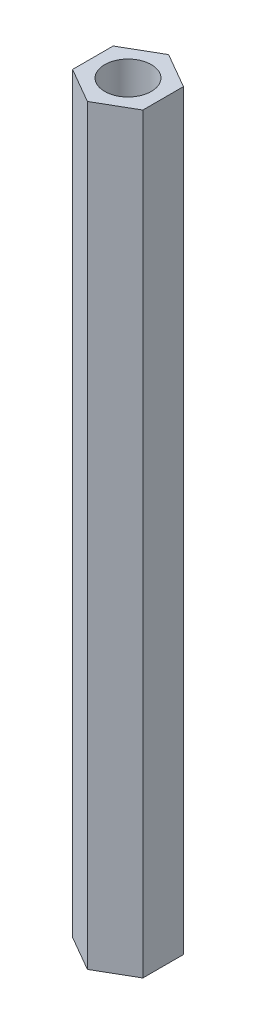
ISO-10303-21;
HEADER;
FILE_DESCRIPTION(('STEP AP214'),'2;1');
FILE_NAME('part.step','',(''),(''),'','','');
FILE_SCHEMA(('AUTOMOTIVE_DESIGN { 1 0 10303 214 1 1 1 1 }'));
ENDSEC;
DATA;
#1=APPLICATION_CONTEXT('core data for automotive mechanical design processes');
#2=APPLICATION_PROTOCOL_DEFINITION('international standard','automotive_design',2000,#1);
#3=PRODUCT_CONTEXT('',#1,'mechanical');
#4=PRODUCT('Part','Part','',(#3));
#5=PRODUCT_RELATED_PRODUCT_CATEGORY('part','',(#4));
#6=PRODUCT_DEFINITION_FORMATION('','',#4);
#7=PRODUCT_DEFINITION_CONTEXT('part definition',#1,'design');
#8=PRODUCT_DEFINITION('design','',#6,#7);
#9=PRODUCT_DEFINITION_SHAPE('','',#8);
#10=(LENGTH_UNIT() NAMED_UNIT(*) SI_UNIT(.MILLI.,.METRE.));
#11=(NAMED_UNIT(*) PLANE_ANGLE_UNIT() SI_UNIT($,.RADIAN.));
#12=(NAMED_UNIT(*) SI_UNIT($,.STERADIAN.) SOLID_ANGLE_UNIT());
#13=UNCERTAINTY_MEASURE_WITH_UNIT(LENGTH_MEASURE(1.E-05),#10,'distance_accuracy_value','');
#14=(GEOMETRIC_REPRESENTATION_CONTEXT(3) GLOBAL_UNCERTAINTY_ASSIGNED_CONTEXT((#13)) GLOBAL_UNIT_ASSIGNED_CONTEXT((#10,
#11,#12)) REPRESENTATION_CONTEXT('',''));
#15=CARTESIAN_POINT('',(0.,0.,0.));
#16=DIRECTION('',(0.,0.,1.));
#17=DIRECTION('',(1.,0.,0.));
#18=AXIS2_PLACEMENT_3D('',#15,#16,#17);
#19=CARTESIAN_POINT('',(0.,50.,0.));
#20=DIRECTION('',(0.,1.,0.));
#21=DIRECTION('',(0.,0.,1.));
#22=AXIS2_PLACEMENT_3D('',#19,#20,#21);
#23=PLANE('',#22);
#24=DIRECTION('',(-0.866025403784439,0.,-0.5));
#25=VECTOR('',#24,1.);
#26=CARTESIAN_POINT('',(2.33826859021798,50.,-1.35));
#27=LINE('',#26,#25);
#28=CARTESIAN_POINT('',(2.33826859021798,50.,-1.35));
#29=VERTEX_POINT('',#28);
#30=CARTESIAN_POINT('',(0.,50.,-2.7));
#31=VERTEX_POINT('',#30);
#32=EDGE_CURVE('E130',#29,#31,#27,.T.);
#33=ORIENTED_EDGE('',*,*,#32,.T.);
#34=DIRECTION('',(-0.866025403784439,0.,0.5));
#35=VECTOR('',#34,1.);
#36=CARTESIAN_POINT('',(0.,50.,-2.7));
#37=LINE('',#36,#35);
#38=CARTESIAN_POINT('',(-2.33826859021798,50.,-1.35));
#39=VERTEX_POINT('',#38);
#40=EDGE_CURVE('E88',#31,#39,#37,.T.);
#41=ORIENTED_EDGE('',*,*,#40,.T.);
#42=DIRECTION('',(0.,0.,1.));
#43=VECTOR('',#42,1.);
#44=CARTESIAN_POINT('',(-2.33826859021798,50.,-1.35));
#45=LINE('',#44,#43);
#46=CARTESIAN_POINT('',(-2.33826859021798,50.,1.35));
#47=VERTEX_POINT('',#46);
#48=EDGE_CURVE('E101',#39,#47,#45,.T.);
#49=ORIENTED_EDGE('',*,*,#48,.T.);
#50=DIRECTION('',(0.866025403784439,0.,0.5));
#51=VECTOR('',#50,1.);
#52=CARTESIAN_POINT('',(-2.33826859021798,50.,1.35));
#53=LINE('',#52,#51);
#54=CARTESIAN_POINT('',(0.,50.,2.7));
#55=VERTEX_POINT('',#54);
#56=EDGE_CURVE('E95',#47,#55,#53,.T.);
#57=ORIENTED_EDGE('',*,*,#56,.T.);
#58=DIRECTION('',(0.866025403784439,0.,-0.5));
#59=VECTOR('',#58,1.);
#60=CARTESIAN_POINT('',(0.,50.,2.7));
#61=LINE('',#60,#59);
#62=CARTESIAN_POINT('',(2.33826859021798,50.,1.35));
#63=VERTEX_POINT('',#62);
#64=EDGE_CURVE('E99',#55,#63,#61,.T.);
#65=ORIENTED_EDGE('',*,*,#64,.T.);
#66=DIRECTION('',(0.,0.,-1.));
#67=VECTOR('',#66,1.);
#68=CARTESIAN_POINT('',(2.33826859021798,50.,1.35));
#69=LINE('',#68,#67);
#70=EDGE_CURVE('E51',#63,#29,#69,.T.);
#71=ORIENTED_EDGE('',*,*,#70,.T.);
#72=EDGE_LOOP('',(#33,#41,#49,#57,#65,#71));
#73=FACE_BOUND('',#72,.T.);
#74=CARTESIAN_POINT('',(0.,50.,0.));
#75=DIRECTION('',(0.,1.,0.));
#76=DIRECTION('',(0.,0.,1.));
#77=AXIS2_PLACEMENT_3D('',#74,#75,#76);
#78=CIRCLE('',#77,1.55);
#79=CARTESIAN_POINT('',(0.,50.,1.55));
#80=VERTEX_POINT('',#79);
#81=EDGE_CURVE('E123',#80,#80,#78,.T.);
#82=ORIENTED_EDGE('',*,*,#81,.F.);
#83=EDGE_LOOP('',(#82));
#84=FACE_BOUND('',#83,.T.);
#85=ADVANCED_FACE('F34',(#73,#84),#23,.T.);
#86=CARTESIAN_POINT('',(0.,0.,0.));
#87=DIRECTION('',(0.,1.,0.));
#88=DIRECTION('',(0.,0.,1.));
#89=AXIS2_PLACEMENT_3D('',#86,#87,#88);
#90=PLANE('',#89);
#91=DIRECTION('',(-0.866025403784439,0.,-0.5));
#92=VECTOR('',#91,1.);
#93=CARTESIAN_POINT('',(2.33826859021798,0.,-1.35));
#94=LINE('',#93,#92);
#95=CARTESIAN_POINT('',(2.33826859021798,0.,-1.35));
#96=VERTEX_POINT('',#95);
#97=CARTESIAN_POINT('',(0.,0.,-2.7));
#98=VERTEX_POINT('',#97);
#99=EDGE_CURVE('E119',#96,#98,#94,.T.);
#100=ORIENTED_EDGE('',*,*,#99,.F.);
#101=DIRECTION('',(0.,0.,-1.));
#102=VECTOR('',#101,1.);
#103=CARTESIAN_POINT('',(2.33826859021798,0.,1.35));
#104=LINE('',#103,#102);
#105=CARTESIAN_POINT('',(2.33826859021798,0.,1.35));
#106=VERTEX_POINT('',#105);
#107=EDGE_CURVE('E80',#106,#96,#104,.T.);
#108=ORIENTED_EDGE('',*,*,#107,.F.);
#109=DIRECTION('',(0.866025403784439,0.,-0.5));
#110=VECTOR('',#109,1.);
#111=CARTESIAN_POINT('',(0.,0.,2.7));
#112=LINE('',#111,#110);
#113=CARTESIAN_POINT('',(0.,0.,2.7));
#114=VERTEX_POINT('',#113);
#115=EDGE_CURVE('E74',#114,#106,#112,.T.);
#116=ORIENTED_EDGE('',*,*,#115,.F.);
#117=DIRECTION('',(0.866025403784439,0.,0.5));
#118=VECTOR('',#117,1.);
#119=CARTESIAN_POINT('',(-2.33826859021798,0.,1.35));
#120=LINE('',#119,#118);
#121=CARTESIAN_POINT('',(-2.33826859021798,0.,1.35));
#122=VERTEX_POINT('',#121);
#123=EDGE_CURVE('E109',#122,#114,#120,.T.);
#124=ORIENTED_EDGE('',*,*,#123,.F.);
#125=DIRECTION('',(0.,0.,1.));
#126=VECTOR('',#125,1.);
#127=CARTESIAN_POINT('',(-2.33826859021798,0.,-1.35));
#128=LINE('',#127,#126);
#129=CARTESIAN_POINT('',(-2.33826859021798,0.,-1.35));
#130=VERTEX_POINT('',#129);
#131=EDGE_CURVE('E125',#130,#122,#128,.T.);
#132=ORIENTED_EDGE('',*,*,#131,.F.);
#133=DIRECTION('',(-0.866025403784439,0.,0.5));
#134=VECTOR('',#133,1.);
#135=CARTESIAN_POINT('',(0.,0.,-2.7));
#136=LINE('',#135,#134);
#137=EDGE_CURVE('E122',#98,#130,#136,.T.);
#138=ORIENTED_EDGE('',*,*,#137,.F.);
#139=EDGE_LOOP('',(#100,#108,#116,#124,#132,#138));
#140=FACE_BOUND('',#139,.T.);
#141=CARTESIAN_POINT('',(0.,0.,0.));
#142=DIRECTION('',(0.,1.,0.));
#143=DIRECTION('',(0.,0.,1.));
#144=AXIS2_PLACEMENT_3D('',#141,#142,#143);
#145=CIRCLE('',#144,1.55);
#146=CARTESIAN_POINT('',(0.,0.,1.55));
#147=VERTEX_POINT('',#146);
#148=EDGE_CURVE('E223',#147,#147,#145,.T.);
#149=ORIENTED_EDGE('',*,*,#148,.T.);
#150=EDGE_LOOP('',(#149));
#151=FACE_BOUND('',#150,.T.);
#152=ADVANCED_FACE('F139',(#140,#151),#90,.F.);
#153=CARTESIAN_POINT('',(2.33826859021798,50.,-1.35));
#154=DIRECTION('',(-0.5,0.,0.866025403784439));
#155=DIRECTION('',(0.866025403784439,0.,0.5));
#156=AXIS2_PLACEMENT_3D('',#153,#154,#155);
#157=PLANE('',#156);
#158=ORIENTED_EDGE('',*,*,#99,.T.);
#159=DIRECTION('',(0.,-1.,0.));
#160=VECTOR('',#159,1.);
#161=CARTESIAN_POINT('',(0.,50.,-2.7));
#162=LINE('',#161,#160);
#163=EDGE_CURVE('E11',#31,#98,#162,.T.);
#164=ORIENTED_EDGE('',*,*,#163,.F.);
#165=ORIENTED_EDGE('',*,*,#32,.F.);
#166=DIRECTION('',(0.,-1.,0.));
#167=VECTOR('',#166,1.);
#168=CARTESIAN_POINT('',(2.33826859021798,50.,-1.35));
#169=LINE('',#168,#167);
#170=EDGE_CURVE('E115',#29,#96,#169,.T.);
#171=ORIENTED_EDGE('',*,*,#170,.T.);
#172=EDGE_LOOP('',(#158,#164,#165,#171));
#173=FACE_BOUND('',#172,.T.);
#174=ADVANCED_FACE('F36',(#173),#157,.F.);
#175=CARTESIAN_POINT('',(0.,50.,-2.7));
#176=DIRECTION('',(0.5,0.,0.866025403784439));
#177=DIRECTION('',(0.866025403784439,0.,-0.5));
#178=AXIS2_PLACEMENT_3D('',#175,#176,#177);
#179=PLANE('',#178);
#180=ORIENTED_EDGE('',*,*,#137,.T.);
#181=DIRECTION('',(0.,-1.,0.));
#182=VECTOR('',#181,1.);
#183=CARTESIAN_POINT('',(-2.33826859021798,50.,-1.35));
#184=LINE('',#183,#182);
#185=EDGE_CURVE('E43',#39,#130,#184,.T.);
#186=ORIENTED_EDGE('',*,*,#185,.F.);
#187=ORIENTED_EDGE('',*,*,#40,.F.);
#188=ORIENTED_EDGE('',*,*,#163,.T.);
#189=EDGE_LOOP('',(#180,#186,#187,#188));
#190=FACE_BOUND('',#189,.T.);
#191=ADVANCED_FACE('F164',(#190),#179,.F.);
#192=CARTESIAN_POINT('',(-2.33826859021798,50.,-1.35));
#193=DIRECTION('',(1.,0.,0.));
#194=DIRECTION('',(0.,0.,-1.));
#195=AXIS2_PLACEMENT_3D('',#192,#193,#194);
#196=PLANE('',#195);
#197=ORIENTED_EDGE('',*,*,#131,.T.);
#198=DIRECTION('',(0.,-1.,0.));
#199=VECTOR('',#198,1.);
#200=CARTESIAN_POINT('',(-2.33826859021798,50.,1.35));
#201=LINE('',#200,#199);
#202=EDGE_CURVE('E110',#47,#122,#201,.T.);
#203=ORIENTED_EDGE('',*,*,#202,.F.);
#204=ORIENTED_EDGE('',*,*,#48,.F.);
#205=ORIENTED_EDGE('',*,*,#185,.T.);
#206=EDGE_LOOP('',(#197,#203,#204,#205));
#207=FACE_BOUND('',#206,.T.);
#208=ADVANCED_FACE('F136',(#207),#196,.F.);
#209=CARTESIAN_POINT('',(-2.33826859021798,50.,1.35));
#210=DIRECTION('',(0.5,0.,-0.866025403784439));
#211=DIRECTION('',(-0.866025403784439,0.,-0.5));
#212=AXIS2_PLACEMENT_3D('',#209,#210,#211);
#213=PLANE('',#212);
#214=ORIENTED_EDGE('',*,*,#123,.T.);
#215=DIRECTION('',(0.,-1.,0.));
#216=VECTOR('',#215,1.);
#217=CARTESIAN_POINT('',(0.,50.,2.7));
#218=LINE('',#217,#216);
#219=EDGE_CURVE('E106',#55,#114,#218,.T.);
#220=ORIENTED_EDGE('',*,*,#219,.F.);
#221=ORIENTED_EDGE('',*,*,#56,.F.);
#222=ORIENTED_EDGE('',*,*,#202,.T.);
#223=EDGE_LOOP('',(#214,#220,#221,#222));
#224=FACE_BOUND('',#223,.T.);
#225=ADVANCED_FACE('F107',(#224),#213,.F.);
#226=CARTESIAN_POINT('',(0.,50.,2.7));
#227=DIRECTION('',(-0.5,0.,-0.866025403784439));
#228=DIRECTION('',(-0.866025403784439,0.,0.5));
#229=AXIS2_PLACEMENT_3D('',#226,#227,#228);
#230=PLANE('',#229);
#231=ORIENTED_EDGE('',*,*,#115,.T.);
#232=DIRECTION('',(0.,-1.,0.));
#233=VECTOR('',#232,1.);
#234=CARTESIAN_POINT('',(2.33826859021798,50.,1.35));
#235=LINE('',#234,#233);
#236=EDGE_CURVE('E111',#63,#106,#235,.T.);
#237=ORIENTED_EDGE('',*,*,#236,.F.);
#238=ORIENTED_EDGE('',*,*,#64,.F.);
#239=ORIENTED_EDGE('',*,*,#219,.T.);
#240=EDGE_LOOP('',(#231,#237,#238,#239));
#241=FACE_BOUND('',#240,.T.);
#242=ADVANCED_FACE('F113',(#241),#230,.F.);
#243=CARTESIAN_POINT('',(2.33826859021798,50.,1.35));
#244=DIRECTION('',(-1.,0.,0.));
#245=DIRECTION('',(0.,0.,1.));
#246=AXIS2_PLACEMENT_3D('',#243,#244,#245);
#247=PLANE('',#246);
#248=ORIENTED_EDGE('',*,*,#107,.T.);
#249=ORIENTED_EDGE('',*,*,#170,.F.);
#250=ORIENTED_EDGE('',*,*,#70,.F.);
#251=ORIENTED_EDGE('',*,*,#236,.T.);
#252=EDGE_LOOP('',(#248,#249,#250,#251));
#253=FACE_BOUND('',#252,.T.);
#254=ADVANCED_FACE('F144',(#253),#247,.F.);
#255=CARTESIAN_POINT('',(0.,50.,0.));
#256=DIRECTION('',(0.,-1.,0.));
#257=DIRECTION('',(0.,0.,-1.));
#258=AXIS2_PLACEMENT_3D('',#255,#256,#257);
#259=CYLINDRICAL_SURFACE('',#258,1.55);
#260=ORIENTED_EDGE('',*,*,#81,.T.);
#261=EDGE_LOOP('',(#260));
#262=FACE_BOUND('',#261,.T.);
#263=ORIENTED_EDGE('',*,*,#148,.F.);
#264=EDGE_LOOP('',(#263));
#265=FACE_BOUND('',#264,.T.);
#266=ADVANCED_FACE('F146',(#262,#265),#259,.F.);
#267=CLOSED_SHELL('',(#85,#152,#174,#191,#208,#225,#242,#254,#266));
#268=MANIFOLD_SOLID_BREP('B2',#267);
#269=ADVANCED_BREP_SHAPE_REPRESENTATION('',(#18,#268),#14);
#270=SHAPE_DEFINITION_REPRESENTATION(#9,#269);
ENDSEC;
END-ISO-10303-21;
